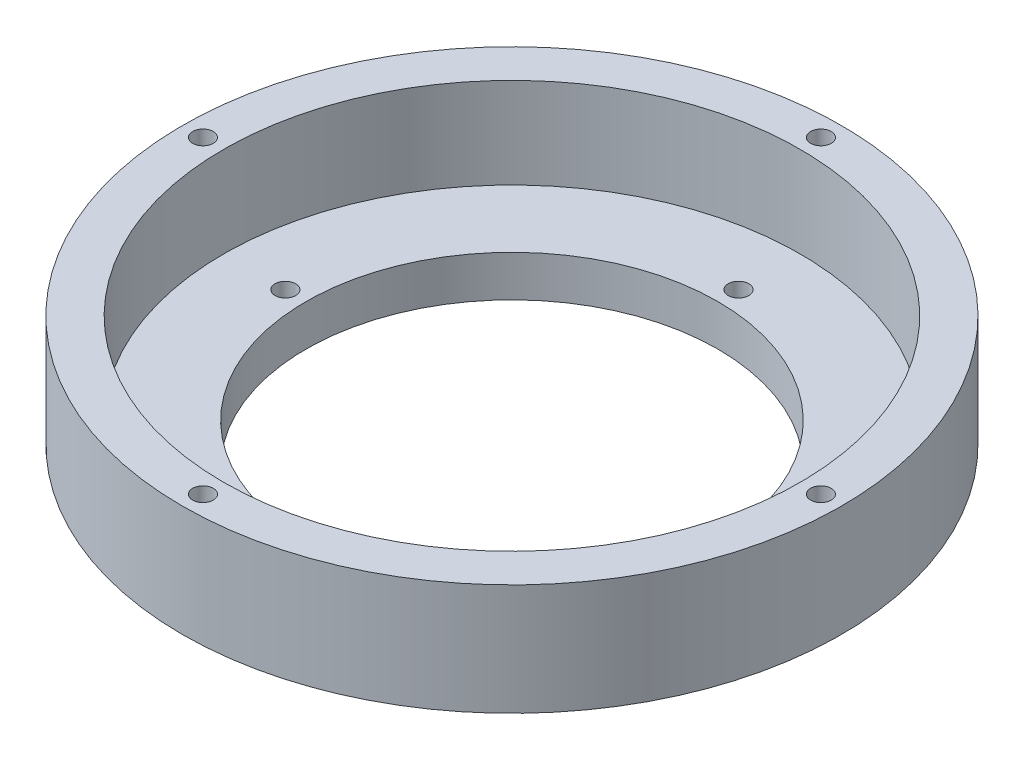
ISO-10303-21;
HEADER;
FILE_DESCRIPTION(('STEP AP214'),'2;1');
FILE_NAME('part.step','',(''),(''),'','','');
FILE_SCHEMA(('AUTOMOTIVE_DESIGN { 1 0 10303 214 1 1 1 1 }'));
ENDSEC;
DATA;
#1=APPLICATION_CONTEXT('core data for automotive mechanical design processes');
#2=APPLICATION_PROTOCOL_DEFINITION('international standard','automotive_design',2000,#1);
#3=PRODUCT_CONTEXT('',#1,'mechanical');
#4=PRODUCT('Part','Part','',(#3));
#5=PRODUCT_RELATED_PRODUCT_CATEGORY('part','',(#4));
#6=PRODUCT_DEFINITION_FORMATION('','',#4);
#7=PRODUCT_DEFINITION_CONTEXT('part definition',#1,'design');
#8=PRODUCT_DEFINITION('design','',#6,#7);
#9=PRODUCT_DEFINITION_SHAPE('','',#8);
#10=(LENGTH_UNIT() NAMED_UNIT(*) SI_UNIT(.MILLI.,.METRE.));
#11=(NAMED_UNIT(*) PLANE_ANGLE_UNIT() SI_UNIT($,.RADIAN.));
#12=(NAMED_UNIT(*) SI_UNIT($,.STERADIAN.) SOLID_ANGLE_UNIT());
#13=UNCERTAINTY_MEASURE_WITH_UNIT(LENGTH_MEASURE(1.E-05),#10,'distance_accuracy_value','');
#14=(GEOMETRIC_REPRESENTATION_CONTEXT(3) GLOBAL_UNCERTAINTY_ASSIGNED_CONTEXT((#13)) GLOBAL_UNIT_ASSIGNED_CONTEXT((#10,
#11,#12)) REPRESENTATION_CONTEXT('',''));
#15=CARTESIAN_POINT('',(0.,0.,0.));
#16=DIRECTION('',(0.,0.,1.));
#17=DIRECTION('',(1.,0.,0.));
#18=AXIS2_PLACEMENT_3D('',#15,#16,#17);
#19=CARTESIAN_POINT('',(0.,10.,0.));
#20=DIRECTION('',(0.,1.,0.));
#21=DIRECTION('',(0.,0.,1.));
#22=AXIS2_PLACEMENT_3D('',#19,#20,#21);
#23=PLANE('',#22);
#24=CARTESIAN_POINT('',(-55.,10.,0.));
#25=DIRECTION('',(0.,1.,0.));
#26=DIRECTION('',(0.,0.,1.));
#27=AXIS2_PLACEMENT_3D('',#24,#25,#26);
#28=CIRCLE('',#27,2.5);
#29=CARTESIAN_POINT('',(-55.,10.,2.5));
#30=VERTEX_POINT('',#29);
#31=EDGE_CURVE('E82',#30,#30,#28,.F.);
#32=ORIENTED_EDGE('',*,*,#31,.T.);
#33=EDGE_LOOP('',(#32));
#34=FACE_BOUND('',#33,.T.);
#35=CARTESIAN_POINT('',(1.94289029309402E-13,10.,55.));
#36=DIRECTION('',(0.,1.,0.));
#37=DIRECTION('',(0.,0.,1.));
#38=AXIS2_PLACEMENT_3D('',#35,#36,#37);
#39=CIRCLE('',#38,2.5);
#40=CARTESIAN_POINT('',(1.94289029309402E-13,10.,57.5));
#41=VERTEX_POINT('',#40);
#42=EDGE_CURVE('E76',#41,#41,#39,.F.);
#43=ORIENTED_EDGE('',*,*,#42,.T.);
#44=EDGE_LOOP('',(#43));
#45=FACE_BOUND('',#44,.T.);
#46=CARTESIAN_POINT('',(-5.759281940243E-13,10.,-55.));
#47=DIRECTION('',(0.,1.,0.));
#48=DIRECTION('',(0.,0.,1.));
#49=AXIS2_PLACEMENT_3D('',#46,#47,#48);
#50=CIRCLE('',#49,2.5);
#51=CARTESIAN_POINT('',(-5.759281940243E-13,10.,-52.5));
#52=VERTEX_POINT('',#51);
#53=EDGE_CURVE('E70',#52,#52,#50,.F.);
#54=ORIENTED_EDGE('',*,*,#53,.T.);
#55=EDGE_LOOP('',(#54));
#56=FACE_BOUND('',#55,.T.);
#57=CARTESIAN_POINT('',(55.,10.,-3.84024409494366E-13));
#58=DIRECTION('',(0.,1.,0.));
#59=DIRECTION('',(0.,0.,1.));
#60=AXIS2_PLACEMENT_3D('',#57,#58,#59);
#61=CIRCLE('',#60,2.5);
#62=CARTESIAN_POINT('',(55.,10.,2.49999999999962));
#63=VERTEX_POINT('',#62);
#64=EDGE_CURVE('E63',#63,#63,#61,.F.);
#65=ORIENTED_EDGE('',*,*,#64,.T.);
#66=EDGE_LOOP('',(#65));
#67=FACE_BOUND('',#66,.T.);
#68=CARTESIAN_POINT('',(0.,10.,0.));
#69=DIRECTION('',(0.,1.,0.));
#70=DIRECTION('',(0.,0.,1.));
#71=AXIS2_PLACEMENT_3D('',#68,#69,#70);
#72=CIRCLE('',#71,50.);
#73=CARTESIAN_POINT('',(0.,10.,50.));
#74=VERTEX_POINT('',#73);
#75=EDGE_CURVE('E53',#74,#74,#72,.T.);
#76=ORIENTED_EDGE('',*,*,#75,.F.);
#77=EDGE_LOOP('',(#76));
#78=FACE_BOUND('',#77,.T.);
#79=CARTESIAN_POINT('',(0.,10.,0.));
#80=DIRECTION('',(0.,1.,0.));
#81=DIRECTION('',(0.,0.,1.));
#82=AXIS2_PLACEMENT_3D('',#79,#80,#81);
#83=CIRCLE('',#82,70.);
#84=CARTESIAN_POINT('',(0.,10.,70.));
#85=VERTEX_POINT('',#84);
#86=EDGE_CURVE('E10',#85,#85,#83,.F.);
#87=ORIENTED_EDGE('',*,*,#86,.F.);
#88=EDGE_LOOP('',(#87));
#89=FACE_BOUND('',#88,.T.);
#90=ADVANCED_FACE('F30',(#34,#45,#56,#67,#78,#89),#23,.T.);
#91=CARTESIAN_POINT('',(0.,0.,0.));
#92=DIRECTION('',(0.,1.,0.));
#93=DIRECTION('',(0.,0.,1.));
#94=AXIS2_PLACEMENT_3D('',#91,#92,#93);
#95=PLANE('',#94);
#96=CARTESIAN_POINT('',(-55.,0.,0.));
#97=DIRECTION('',(0.,-1.,0.));
#98=DIRECTION('',(0.,0.,-1.));
#99=AXIS2_PLACEMENT_3D('',#96,#97,#98);
#100=CIRCLE('',#99,2.5);
#101=CARTESIAN_POINT('',(-55.,0.,-2.5));
#102=VERTEX_POINT('',#101);
#103=EDGE_CURVE('E62',#102,#102,#100,.T.);
#104=ORIENTED_EDGE('',*,*,#103,.F.);
#105=EDGE_LOOP('',(#104));
#106=FACE_BOUND('',#105,.T.);
#107=CARTESIAN_POINT('',(1.94289029309402E-13,0.,55.));
#108=DIRECTION('',(0.,-1.,0.));
#109=DIRECTION('',(0.,0.,-1.));
#110=AXIS2_PLACEMENT_3D('',#107,#108,#109);
#111=CIRCLE('',#110,2.5);
#112=CARTESIAN_POINT('',(1.94289029309402E-13,0.,52.5));
#113=VERTEX_POINT('',#112);
#114=EDGE_CURVE('E79',#113,#113,#111,.T.);
#115=ORIENTED_EDGE('',*,*,#114,.F.);
#116=EDGE_LOOP('',(#115));
#117=FACE_BOUND('',#116,.T.);
#118=CARTESIAN_POINT('',(-5.759281940243E-13,0.,-55.));
#119=DIRECTION('',(0.,-1.,0.));
#120=DIRECTION('',(0.,0.,-1.));
#121=AXIS2_PLACEMENT_3D('',#118,#119,#120);
#122=CIRCLE('',#121,2.5);
#123=CARTESIAN_POINT('',(-5.759281940243E-13,0.,-57.5));
#124=VERTEX_POINT('',#123);
#125=EDGE_CURVE('E73',#124,#124,#122,.T.);
#126=ORIENTED_EDGE('',*,*,#125,.F.);
#127=EDGE_LOOP('',(#126));
#128=FACE_BOUND('',#127,.T.);
#129=CARTESIAN_POINT('',(55.,0.,-3.84024409494366E-13));
#130=DIRECTION('',(0.,-1.,0.));
#131=DIRECTION('',(0.,0.,-1.));
#132=AXIS2_PLACEMENT_3D('',#129,#130,#131);
#133=CIRCLE('',#132,2.5);
#134=CARTESIAN_POINT('',(55.,0.,-2.50000000000039));
#135=VERTEX_POINT('',#134);
#136=EDGE_CURVE('E66',#135,#135,#133,.T.);
#137=ORIENTED_EDGE('',*,*,#136,.F.);
#138=EDGE_LOOP('',(#137));
#139=FACE_BOUND('',#138,.T.);
#140=CARTESIAN_POINT('',(0.,0.,0.));
#141=DIRECTION('',(0.,1.,0.));
#142=DIRECTION('',(0.,0.,1.));
#143=AXIS2_PLACEMENT_3D('',#140,#141,#142);
#144=CIRCLE('',#143,60.);
#145=CARTESIAN_POINT('',(0.,0.,60.));
#146=VERTEX_POINT('',#145);
#147=EDGE_CURVE('E41',#146,#146,#144,.T.);
#148=ORIENTED_EDGE('',*,*,#147,.F.);
#149=EDGE_LOOP('',(#148));
#150=FACE_BOUND('',#149,.T.);
#151=CARTESIAN_POINT('',(0.,0.,0.));
#152=DIRECTION('',(0.,1.,0.));
#153=DIRECTION('',(0.,0.,1.));
#154=AXIS2_PLACEMENT_3D('',#151,#152,#153);
#155=CIRCLE('',#154,50.);
#156=CARTESIAN_POINT('',(0.,0.,50.));
#157=VERTEX_POINT('',#156);
#158=EDGE_CURVE('E46',#157,#157,#155,.T.);
#159=ORIENTED_EDGE('',*,*,#158,.T.);
#160=EDGE_LOOP('',(#159));
#161=FACE_BOUND('',#160,.T.);
#162=ADVANCED_FACE('F146',(#106,#117,#128,#139,#150,#161),#95,.F.);
#163=CARTESIAN_POINT('',(0.,5.,0.));
#164=DIRECTION('',(0.,-1.,0.));
#165=DIRECTION('',(0.,0.,-1.));
#166=AXIS2_PLACEMENT_3D('',#163,#164,#165);
#167=CYLINDRICAL_SURFACE('',#166,60.);
#168=CARTESIAN_POINT('',(0.,5.,0.));
#169=DIRECTION('',(0.,1.,0.));
#170=DIRECTION('',(0.,0.,1.));
#171=AXIS2_PLACEMENT_3D('',#168,#169,#170);
#172=CIRCLE('',#171,60.);
#173=CARTESIAN_POINT('',(0.,5.,60.));
#174=VERTEX_POINT('',#173);
#175=EDGE_CURVE('E37',#174,#174,#172,.T.);
#176=ORIENTED_EDGE('',*,*,#175,.F.);
#177=EDGE_LOOP('',(#176));
#178=FACE_BOUND('',#177,.T.);
#179=ORIENTED_EDGE('',*,*,#147,.T.);
#180=EDGE_LOOP('',(#179));
#181=FACE_BOUND('',#180,.T.);
#182=ADVANCED_FACE('F32',(#178,#181),#167,.T.);
#183=CARTESIAN_POINT('',(0.,5.,0.));
#184=DIRECTION('',(0.,-1.,0.));
#185=DIRECTION('',(0.,0.,-1.));
#186=AXIS2_PLACEMENT_3D('',#183,#184,#185);
#187=CYLINDRICAL_SURFACE('',#186,50.);
#188=ORIENTED_EDGE('',*,*,#158,.F.);
#189=EDGE_LOOP('',(#188));
#190=FACE_BOUND('',#189,.T.);
#191=ORIENTED_EDGE('',*,*,#75,.T.);
#192=EDGE_LOOP('',(#191));
#193=FACE_BOUND('',#192,.T.);
#194=ADVANCED_FACE('F158',(#190,#193),#187,.F.);
#195=CARTESIAN_POINT('',(0.,5.,0.));
#196=DIRECTION('',(0.,1.,0.));
#197=DIRECTION('',(0.,0.,1.));
#198=AXIS2_PLACEMENT_3D('',#195,#196,#197);
#199=PLANE('',#198);
#200=ORIENTED_EDGE('',*,*,#175,.T.);
#201=EDGE_LOOP('',(#200));
#202=FACE_BOUND('',#201,.T.);
#203=CARTESIAN_POINT('',(0.,5.,0.));
#204=DIRECTION('',(0.,1.,0.));
#205=DIRECTION('',(0.,0.,1.));
#206=AXIS2_PLACEMENT_3D('',#203,#204,#205);
#207=CIRCLE('',#206,80.);
#208=CARTESIAN_POINT('',(0.,5.,80.));
#209=VERTEX_POINT('',#208);
#210=EDGE_CURVE('E50',#209,#209,#207,.T.);
#211=ORIENTED_EDGE('',*,*,#210,.F.);
#212=EDGE_LOOP('',(#211));
#213=FACE_BOUND('',#212,.T.);
#214=ADVANCED_FACE('F155',(#202,#213),#199,.F.);
#215=CARTESIAN_POINT('',(0.,10.,0.));
#216=DIRECTION('',(0.,-1.,0.));
#217=DIRECTION('',(0.,0.,-1.));
#218=AXIS2_PLACEMENT_3D('',#215,#216,#217);
#219=CYLINDRICAL_SURFACE('',#218,80.);
#220=ORIENTED_EDGE('',*,*,#210,.T.);
#221=EDGE_LOOP('',(#220));
#222=FACE_BOUND('',#221,.T.);
#223=CARTESIAN_POINT('',(0.,32.,0.));
#224=DIRECTION('',(0.,1.,0.));
#225=DIRECTION('',(0.,0.,1.));
#226=AXIS2_PLACEMENT_3D('',#223,#224,#225);
#227=CIRCLE('',#226,80.);
#228=CARTESIAN_POINT('',(0.,32.,80.));
#229=VERTEX_POINT('',#228);
#230=EDGE_CURVE('E56',#229,#229,#227,.T.);
#231=ORIENTED_EDGE('',*,*,#230,.F.);
#232=EDGE_LOOP('',(#231));
#233=FACE_BOUND('',#232,.T.);
#234=ADVANCED_FACE('F124',(#222,#233),#219,.T.);
#235=CARTESIAN_POINT('',(0.,32.,0.));
#236=DIRECTION('',(0.,1.,0.));
#237=DIRECTION('',(0.,0.,1.));
#238=AXIS2_PLACEMENT_3D('',#235,#236,#237);
#239=PLANE('',#238);
#240=CARTESIAN_POINT('',(-75.,32.,0.));
#241=DIRECTION('',(0.,1.,0.));
#242=DIRECTION('',(0.,0.,1.));
#243=AXIS2_PLACEMENT_3D('',#240,#241,#242);
#244=CIRCLE('',#243,2.5);
#245=CARTESIAN_POINT('',(-75.,32.,2.5));
#246=VERTEX_POINT('',#245);
#247=EDGE_CURVE('E105',#246,#246,#244,.T.);
#248=ORIENTED_EDGE('',*,*,#247,.F.);
#249=EDGE_LOOP('',(#248));
#250=FACE_BOUND('',#249,.T.);
#251=CARTESIAN_POINT('',(0.,32.,-75.));
#252=DIRECTION('',(0.,1.,0.));
#253=DIRECTION('',(0.,0.,1.));
#254=AXIS2_PLACEMENT_3D('',#251,#252,#253);
#255=CIRCLE('',#254,2.5);
#256=CARTESIAN_POINT('',(0.,32.,-72.5));
#257=VERTEX_POINT('',#256);
#258=EDGE_CURVE('E99',#257,#257,#255,.T.);
#259=ORIENTED_EDGE('',*,*,#258,.F.);
#260=EDGE_LOOP('',(#259));
#261=FACE_BOUND('',#260,.T.);
#262=CARTESIAN_POINT('',(0.,32.,75.));
#263=DIRECTION('',(0.,1.,0.));
#264=DIRECTION('',(0.,0.,1.));
#265=AXIS2_PLACEMENT_3D('',#262,#263,#264);
#266=CIRCLE('',#265,2.5);
#267=CARTESIAN_POINT('',(0.,32.,77.5));
#268=VERTEX_POINT('',#267);
#269=EDGE_CURVE('E93',#268,#268,#266,.T.);
#270=ORIENTED_EDGE('',*,*,#269,.F.);
#271=EDGE_LOOP('',(#270));
#272=FACE_BOUND('',#271,.T.);
#273=CARTESIAN_POINT('',(75.,32.,0.));
#274=DIRECTION('',(0.,1.,0.));
#275=DIRECTION('',(0.,0.,1.));
#276=AXIS2_PLACEMENT_3D('',#273,#274,#275);
#277=CIRCLE('',#276,2.5);
#278=CARTESIAN_POINT('',(75.,32.,2.5));
#279=VERTEX_POINT('',#278);
#280=EDGE_CURVE('E87',#279,#279,#277,.T.);
#281=ORIENTED_EDGE('',*,*,#280,.F.);
#282=EDGE_LOOP('',(#281));
#283=FACE_BOUND('',#282,.T.);
#284=ORIENTED_EDGE('',*,*,#230,.T.);
#285=EDGE_LOOP('',(#284));
#286=FACE_BOUND('',#285,.T.);
#287=CARTESIAN_POINT('',(0.,32.,0.));
#288=DIRECTION('',(0.,1.,0.));
#289=DIRECTION('',(0.,0.,1.));
#290=AXIS2_PLACEMENT_3D('',#287,#288,#289);
#291=CIRCLE('',#290,70.);
#292=CARTESIAN_POINT('',(0.,32.,70.));
#293=VERTEX_POINT('',#292);
#294=EDGE_CURVE('E59',#293,#293,#291,.T.);
#295=ORIENTED_EDGE('',*,*,#294,.F.);
#296=EDGE_LOOP('',(#295));
#297=FACE_BOUND('',#296,.T.);
#298=ADVANCED_FACE('F120',(#250,#261,#272,#283,#286,#297),#239,.T.);
#299=CARTESIAN_POINT('',(0.,32.,0.));
#300=DIRECTION('',(0.,-1.,0.));
#301=DIRECTION('',(0.,0.,-1.));
#302=AXIS2_PLACEMENT_3D('',#299,#300,#301);
#303=CYLINDRICAL_SURFACE('',#302,70.);
#304=ORIENTED_EDGE('',*,*,#294,.T.);
#305=EDGE_LOOP('',(#304));
#306=FACE_BOUND('',#305,.T.);
#307=ORIENTED_EDGE('',*,*,#86,.T.);
#308=EDGE_LOOP('',(#307));
#309=FACE_BOUND('',#308,.T.);
#310=ADVANCED_FACE('F123',(#306,#309),#303,.F.);
#311=CARTESIAN_POINT('',(55.,32.001,-3.84024409494366E-13));
#312=DIRECTION('',(0.,-1.,0.));
#313=DIRECTION('',(0.,0.,-1.));
#314=AXIS2_PLACEMENT_3D('',#311,#312,#313);
#315=CYLINDRICAL_SURFACE('',#314,2.5);
#316=ORIENTED_EDGE('',*,*,#64,.F.);
#317=EDGE_LOOP('',(#316));
#318=FACE_BOUND('',#317,.T.);
#319=ORIENTED_EDGE('',*,*,#136,.T.);
#320=EDGE_LOOP('',(#319));
#321=FACE_BOUND('',#320,.T.);
#322=ADVANCED_FACE('F137',(#318,#321),#315,.F.);
#323=CARTESIAN_POINT('',(-5.759281940243E-13,32.001,-55.));
#324=DIRECTION('',(0.,-1.,0.));
#325=DIRECTION('',(0.,0.,-1.));
#326=AXIS2_PLACEMENT_3D('',#323,#324,#325);
#327=CYLINDRICAL_SURFACE('',#326,2.5);
#328=ORIENTED_EDGE('',*,*,#53,.F.);
#329=EDGE_LOOP('',(#328));
#330=FACE_BOUND('',#329,.T.);
#331=ORIENTED_EDGE('',*,*,#125,.T.);
#332=EDGE_LOOP('',(#331));
#333=FACE_BOUND('',#332,.T.);
#334=ADVANCED_FACE('F142',(#330,#333),#327,.F.);
#335=CARTESIAN_POINT('',(1.94289029309402E-13,32.001,55.));
#336=DIRECTION('',(0.,-1.,0.));
#337=DIRECTION('',(0.,0.,-1.));
#338=AXIS2_PLACEMENT_3D('',#335,#336,#337);
#339=CYLINDRICAL_SURFACE('',#338,2.5);
#340=ORIENTED_EDGE('',*,*,#42,.F.);
#341=EDGE_LOOP('',(#340));
#342=FACE_BOUND('',#341,.T.);
#343=ORIENTED_EDGE('',*,*,#114,.T.);
#344=EDGE_LOOP('',(#343));
#345=FACE_BOUND('',#344,.T.);
#346=ADVANCED_FACE('F201',(#342,#345),#339,.F.);
#347=CARTESIAN_POINT('',(-55.,32.001,0.));
#348=DIRECTION('',(0.,-1.,0.));
#349=DIRECTION('',(0.,0.,-1.));
#350=AXIS2_PLACEMENT_3D('',#347,#348,#349);
#351=CYLINDRICAL_SURFACE('',#350,2.5);
#352=ORIENTED_EDGE('',*,*,#31,.F.);
#353=EDGE_LOOP('',(#352));
#354=FACE_BOUND('',#353,.T.);
#355=ORIENTED_EDGE('',*,*,#103,.T.);
#356=EDGE_LOOP('',(#355));
#357=FACE_BOUND('',#356,.T.);
#358=ADVANCED_FACE('F211',(#354,#357),#351,.F.);
#359=CARTESIAN_POINT('',(75.,22.,0.));
#360=DIRECTION('',(0.,1.,0.));
#361=DIRECTION('',(0.,0.,1.));
#362=AXIS2_PLACEMENT_3D('',#359,#360,#361);
#363=CYLINDRICAL_SURFACE('',#362,2.5);
#364=CARTESIAN_POINT('',(75.,22.,0.));
#365=DIRECTION('',(0.,1.,0.));
#366=DIRECTION('',(0.,0.,1.));
#367=AXIS2_PLACEMENT_3D('',#364,#365,#366);
#368=CIRCLE('',#367,2.5);
#369=CARTESIAN_POINT('',(75.,22.,2.5));
#370=VERTEX_POINT('',#369);
#371=EDGE_CURVE('E90',#370,#370,#368,.T.);
#372=ORIENTED_EDGE('',*,*,#371,.F.);
#373=EDGE_LOOP('',(#372));
#374=FACE_BOUND('',#373,.T.);
#375=ORIENTED_EDGE('',*,*,#280,.T.);
#376=EDGE_LOOP('',(#375));
#377=FACE_BOUND('',#376,.T.);
#378=ADVANCED_FACE('F221',(#374,#377),#363,.F.);
#379=CARTESIAN_POINT('',(75.,22.,0.));
#380=DIRECTION('',(0.,1.,0.));
#381=DIRECTION('',(0.,0.,1.));
#382=AXIS2_PLACEMENT_3D('',#379,#380,#381);
#383=PLANE('',#382);
#384=ORIENTED_EDGE('',*,*,#371,.T.);
#385=EDGE_LOOP('',(#384));
#386=FACE_BOUND('',#385,.T.);
#387=ADVANCED_FACE('F238',(#386),#383,.T.);
#388=CARTESIAN_POINT('',(0.,22.,75.));
#389=DIRECTION('',(0.,1.,0.));
#390=DIRECTION('',(0.,0.,1.));
#391=AXIS2_PLACEMENT_3D('',#388,#389,#390);
#392=CYLINDRICAL_SURFACE('',#391,2.5);
#393=CARTESIAN_POINT('',(0.,22.,75.));
#394=DIRECTION('',(0.,1.,0.));
#395=DIRECTION('',(0.,0.,1.));
#396=AXIS2_PLACEMENT_3D('',#393,#394,#395);
#397=CIRCLE('',#396,2.5);
#398=CARTESIAN_POINT('',(0.,22.,77.5));
#399=VERTEX_POINT('',#398);
#400=EDGE_CURVE('E96',#399,#399,#397,.T.);
#401=ORIENTED_EDGE('',*,*,#400,.F.);
#402=EDGE_LOOP('',(#401));
#403=FACE_BOUND('',#402,.T.);
#404=ORIENTED_EDGE('',*,*,#269,.T.);
#405=EDGE_LOOP('',(#404));
#406=FACE_BOUND('',#405,.T.);
#407=ADVANCED_FACE('F248',(#403,#406),#392,.F.);
#408=CARTESIAN_POINT('',(0.,22.,75.));
#409=DIRECTION('',(0.,1.,0.));
#410=DIRECTION('',(0.,0.,1.));
#411=AXIS2_PLACEMENT_3D('',#408,#409,#410);
#412=PLANE('',#411);
#413=ORIENTED_EDGE('',*,*,#400,.T.);
#414=EDGE_LOOP('',(#413));
#415=FACE_BOUND('',#414,.T.);
#416=ADVANCED_FACE('F258',(#415),#412,.T.);
#417=CARTESIAN_POINT('',(0.,22.,-75.));
#418=DIRECTION('',(0.,1.,0.));
#419=DIRECTION('',(0.,0.,1.));
#420=AXIS2_PLACEMENT_3D('',#417,#418,#419);
#421=CYLINDRICAL_SURFACE('',#420,2.5);
#422=CARTESIAN_POINT('',(0.,22.,-75.));
#423=DIRECTION('',(0.,1.,0.));
#424=DIRECTION('',(0.,0.,1.));
#425=AXIS2_PLACEMENT_3D('',#422,#423,#424);
#426=CIRCLE('',#425,2.5);
#427=CARTESIAN_POINT('',(0.,22.,-72.5));
#428=VERTEX_POINT('',#427);
#429=EDGE_CURVE('E102',#428,#428,#426,.T.);
#430=ORIENTED_EDGE('',*,*,#429,.F.);
#431=EDGE_LOOP('',(#430));
#432=FACE_BOUND('',#431,.T.);
#433=ORIENTED_EDGE('',*,*,#258,.T.);
#434=EDGE_LOOP('',(#433));
#435=FACE_BOUND('',#434,.T.);
#436=ADVANCED_FACE('F268',(#432,#435),#421,.F.);
#437=CARTESIAN_POINT('',(0.,22.,-75.));
#438=DIRECTION('',(0.,1.,0.));
#439=DIRECTION('',(0.,0.,1.));
#440=AXIS2_PLACEMENT_3D('',#437,#438,#439);
#441=PLANE('',#440);
#442=ORIENTED_EDGE('',*,*,#429,.T.);
#443=EDGE_LOOP('',(#442));
#444=FACE_BOUND('',#443,.T.);
#445=ADVANCED_FACE('F116',(#444),#441,.T.);
#446=CARTESIAN_POINT('',(-75.,22.,0.));
#447=DIRECTION('',(0.,1.,0.));
#448=DIRECTION('',(0.,0.,1.));
#449=AXIS2_PLACEMENT_3D('',#446,#447,#448);
#450=CYLINDRICAL_SURFACE('',#449,2.5);
#451=CARTESIAN_POINT('',(-75.,22.,0.));
#452=DIRECTION('',(0.,1.,0.));
#453=DIRECTION('',(0.,0.,1.));
#454=AXIS2_PLACEMENT_3D('',#451,#452,#453);
#455=CIRCLE('',#454,2.5);
#456=CARTESIAN_POINT('',(-75.,22.,2.5));
#457=VERTEX_POINT('',#456);
#458=EDGE_CURVE('E67',#457,#457,#455,.T.);
#459=ORIENTED_EDGE('',*,*,#458,.F.);
#460=EDGE_LOOP('',(#459));
#461=FACE_BOUND('',#460,.T.);
#462=ORIENTED_EDGE('',*,*,#247,.T.);
#463=EDGE_LOOP('',(#462));
#464=FACE_BOUND('',#463,.T.);
#465=ADVANCED_FACE('F113',(#461,#464),#450,.F.);
#466=CARTESIAN_POINT('',(-75.,22.,0.));
#467=DIRECTION('',(0.,1.,0.));
#468=DIRECTION('',(0.,0.,1.));
#469=AXIS2_PLACEMENT_3D('',#466,#467,#468);
#470=PLANE('',#469);
#471=ORIENTED_EDGE('',*,*,#458,.T.);
#472=EDGE_LOOP('',(#471));
#473=FACE_BOUND('',#472,.T.);
#474=ADVANCED_FACE('F111',(#473),#470,.T.);
#475=CLOSED_SHELL('',(#90,#162,#182,#194,#214,#234,#298,#310,#322,#334,#346,#358,#378,#387,#407,
#416,#436,#445,#465,#474));
#476=MANIFOLD_SOLID_BREP('B2',#475);
#477=ADVANCED_BREP_SHAPE_REPRESENTATION('',(#18,#476),#14);
#478=SHAPE_DEFINITION_REPRESENTATION(#9,#477);
ENDSEC;
END-ISO-10303-21;
